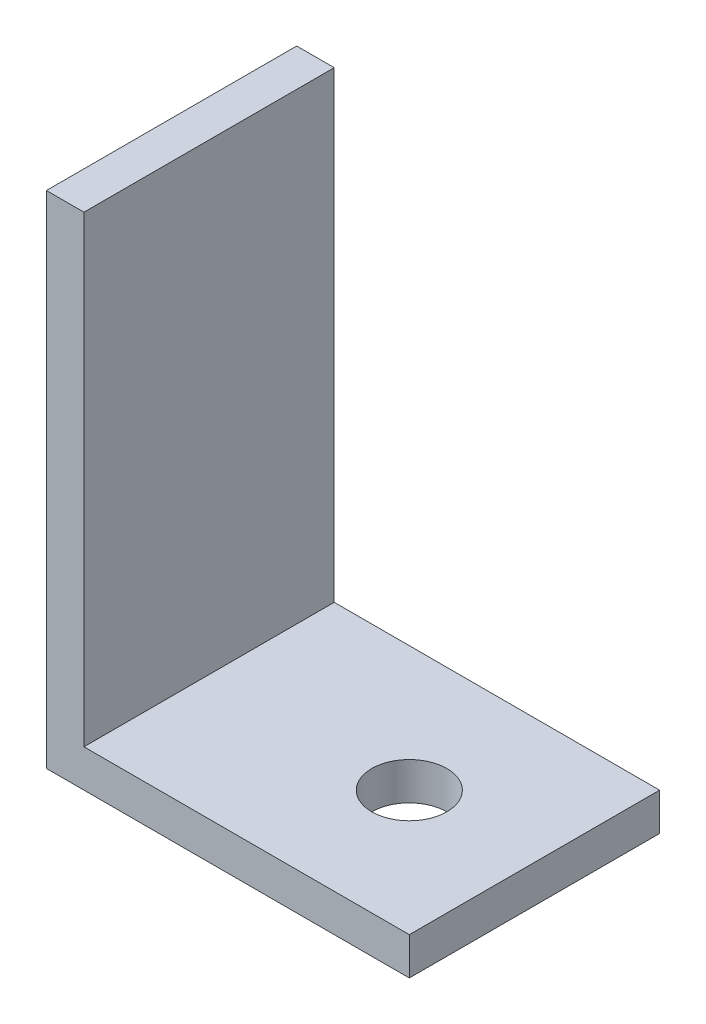
ISO-10303-21;
HEADER;
FILE_DESCRIPTION(('STEP AP214'),'2;1');
FILE_NAME('part.step','',(''),(''),'','','');
FILE_SCHEMA(('AUTOMOTIVE_DESIGN { 1 0 10303 214 1 1 1 1 }'));
ENDSEC;
DATA;
#1=APPLICATION_CONTEXT('core data for automotive mechanical design processes');
#2=APPLICATION_PROTOCOL_DEFINITION('international standard','automotive_design',2000,#1);
#3=PRODUCT_CONTEXT('',#1,'mechanical');
#4=PRODUCT('Part','Part','',(#3));
#5=PRODUCT_RELATED_PRODUCT_CATEGORY('part','',(#4));
#6=PRODUCT_DEFINITION_FORMATION('','',#4);
#7=PRODUCT_DEFINITION_CONTEXT('part definition',#1,'design');
#8=PRODUCT_DEFINITION('design','',#6,#7);
#9=PRODUCT_DEFINITION_SHAPE('','',#8);
#10=(LENGTH_UNIT() NAMED_UNIT(*) SI_UNIT(.MILLI.,.METRE.));
#11=(NAMED_UNIT(*) PLANE_ANGLE_UNIT() SI_UNIT($,.RADIAN.));
#12=(NAMED_UNIT(*) SI_UNIT($,.STERADIAN.) SOLID_ANGLE_UNIT());
#13=UNCERTAINTY_MEASURE_WITH_UNIT(LENGTH_MEASURE(1.E-05),#10,'distance_accuracy_value','');
#14=(GEOMETRIC_REPRESENTATION_CONTEXT(3) GLOBAL_UNCERTAINTY_ASSIGNED_CONTEXT((#13)) GLOBAL_UNIT_ASSIGNED_CONTEXT((#10,
#11,#12)) REPRESENTATION_CONTEXT('',''));
#15=CARTESIAN_POINT('',(0.,0.,0.));
#16=DIRECTION('',(0.,0.,1.));
#17=DIRECTION('',(1.,0.,0.));
#18=AXIS2_PLACEMENT_3D('',#15,#16,#17);
#19=CARTESIAN_POINT('',(29.,0.,20.));
#20=DIRECTION('',(0.,1.,0.));
#21=DIRECTION('',(-1.,0.,0.));
#22=AXIS2_PLACEMENT_3D('',#19,#20,#21);
#23=PLANE('',#22);
#24=CARTESIAN_POINT('',(19.,0.,10.));
#25=DIRECTION('',(0.,1.,0.));
#26=DIRECTION('',(-1.,0.,0.));
#27=AXIS2_PLACEMENT_3D('',#24,#25,#26);
#28=CIRCLE('',#27,3.);
#29=CARTESIAN_POINT('',(16.,0.,10.));
#30=VERTEX_POINT('',#29);
#31=EDGE_CURVE('E121',#30,#30,#28,.T.);
#32=ORIENTED_EDGE('',*,*,#31,.T.);
#33=EDGE_LOOP('',(#32));
#34=FACE_BOUND('',#33,.T.);
#35=DIRECTION('',(1.,0.,0.));
#36=VECTOR('',#35,1.);
#37=CARTESIAN_POINT('',(29.,0.,0.));
#38=LINE('',#37,#36);
#39=CARTESIAN_POINT('',(0.,0.,0.));
#40=VERTEX_POINT('',#39);
#41=CARTESIAN_POINT('',(29.,0.,0.));
#42=VERTEX_POINT('',#41);
#43=EDGE_CURVE('E117',#40,#42,#38,.T.);
#44=ORIENTED_EDGE('',*,*,#43,.T.);
#45=DIRECTION('',(0.,0.,-1.));
#46=VECTOR('',#45,1.);
#47=CARTESIAN_POINT('',(29.,0.,20.));
#48=LINE('',#47,#46);
#49=CARTESIAN_POINT('',(29.,0.,20.));
#50=VERTEX_POINT('',#49);
#51=EDGE_CURVE('E11',#50,#42,#48,.T.);
#52=ORIENTED_EDGE('',*,*,#51,.F.);
#53=DIRECTION('',(1.,0.,0.));
#54=VECTOR('',#53,1.);
#55=CARTESIAN_POINT('',(29.,0.,20.));
#56=LINE('',#55,#54);
#57=CARTESIAN_POINT('',(0.,0.,20.));
#58=VERTEX_POINT('',#57);
#59=EDGE_CURVE('E128',#58,#50,#56,.T.);
#60=ORIENTED_EDGE('',*,*,#59,.F.);
#61=DIRECTION('',(0.,0.,-1.));
#62=VECTOR('',#61,1.);
#63=CARTESIAN_POINT('',(0.,0.,20.));
#64=LINE('',#63,#62);
#65=EDGE_CURVE('E113',#58,#40,#64,.T.);
#66=ORIENTED_EDGE('',*,*,#65,.T.);
#67=EDGE_LOOP('',(#44,#52,#60,#66));
#68=FACE_BOUND('',#67,.T.);
#69=ADVANCED_FACE('F33',(#34,#68),#23,.F.);
#70=CARTESIAN_POINT('',(29.,3.,20.));
#71=DIRECTION('',(-1.,0.,0.));
#72=DIRECTION('',(0.,0.,1.));
#73=AXIS2_PLACEMENT_3D('',#70,#71,#72);
#74=PLANE('',#73);
#75=DIRECTION('',(0.,1.,0.));
#76=VECTOR('',#75,1.);
#77=CARTESIAN_POINT('',(29.,3.,0.));
#78=LINE('',#77,#76);
#79=CARTESIAN_POINT('',(29.,3.,0.));
#80=VERTEX_POINT('',#79);
#81=EDGE_CURVE('E120',#42,#80,#78,.T.);
#82=ORIENTED_EDGE('',*,*,#81,.T.);
#83=DIRECTION('',(0.,0.,-1.));
#84=VECTOR('',#83,1.);
#85=CARTESIAN_POINT('',(29.,3.,20.));
#86=LINE('',#85,#84);
#87=CARTESIAN_POINT('',(29.,3.,20.));
#88=VERTEX_POINT('',#87);
#89=EDGE_CURVE('E41',#88,#80,#86,.T.);
#90=ORIENTED_EDGE('',*,*,#89,.F.);
#91=DIRECTION('',(0.,1.,0.));
#92=VECTOR('',#91,1.);
#93=CARTESIAN_POINT('',(29.,3.,20.));
#94=LINE('',#93,#92);
#95=EDGE_CURVE('E86',#50,#88,#94,.T.);
#96=ORIENTED_EDGE('',*,*,#95,.F.);
#97=ORIENTED_EDGE('',*,*,#51,.T.);
#98=EDGE_LOOP('',(#82,#90,#96,#97));
#99=FACE_BOUND('',#98,.T.);
#100=ADVANCED_FACE('F152',(#99),#74,.F.);
#101=CARTESIAN_POINT('',(3.,3.,20.));
#102=DIRECTION('',(0.,-1.,0.));
#103=DIRECTION('',(1.,0.,0.));
#104=AXIS2_PLACEMENT_3D('',#101,#102,#103);
#105=PLANE('',#104);
#106=CARTESIAN_POINT('',(19.,3.,10.));
#107=DIRECTION('',(0.,1.,0.));
#108=DIRECTION('',(-1.,0.,0.));
#109=AXIS2_PLACEMENT_3D('',#106,#107,#108);
#110=CIRCLE('',#109,3.);
#111=CARTESIAN_POINT('',(16.,3.,10.));
#112=VERTEX_POINT('',#111);
#113=EDGE_CURVE('E160',#112,#112,#110,.T.);
#114=ORIENTED_EDGE('',*,*,#113,.F.);
#115=EDGE_LOOP('',(#114));
#116=FACE_BOUND('',#115,.T.);
#117=DIRECTION('',(-1.,0.,0.));
#118=VECTOR('',#117,1.);
#119=CARTESIAN_POINT('',(3.,3.,0.));
#120=LINE('',#119,#118);
#121=CARTESIAN_POINT('',(3.,3.,0.));
#122=VERTEX_POINT('',#121);
#123=EDGE_CURVE('E123',#80,#122,#120,.T.);
#124=ORIENTED_EDGE('',*,*,#123,.T.);
#125=DIRECTION('',(0.,0.,-1.));
#126=VECTOR('',#125,1.);
#127=CARTESIAN_POINT('',(3.,3.,20.));
#128=LINE('',#127,#126);
#129=CARTESIAN_POINT('',(3.,3.,20.));
#130=VERTEX_POINT('',#129);
#131=EDGE_CURVE('E108',#130,#122,#128,.T.);
#132=ORIENTED_EDGE('',*,*,#131,.F.);
#133=DIRECTION('',(-1.,0.,0.));
#134=VECTOR('',#133,1.);
#135=CARTESIAN_POINT('',(3.,3.,20.));
#136=LINE('',#135,#134);
#137=EDGE_CURVE('E99',#88,#130,#136,.T.);
#138=ORIENTED_EDGE('',*,*,#137,.F.);
#139=ORIENTED_EDGE('',*,*,#89,.T.);
#140=EDGE_LOOP('',(#124,#132,#138,#139));
#141=FACE_BOUND('',#140,.T.);
#142=ADVANCED_FACE('F134',(#116,#141),#105,.F.);
#143=CARTESIAN_POINT('',(3.,40.,20.));
#144=DIRECTION('',(-1.,0.,0.));
#145=DIRECTION('',(0.,-1.,0.));
#146=AXIS2_PLACEMENT_3D('',#143,#144,#145);
#147=PLANE('',#146);
#148=DIRECTION('',(0.,1.,0.));
#149=VECTOR('',#148,1.);
#150=CARTESIAN_POINT('',(3.,40.,0.));
#151=LINE('',#150,#149);
#152=CARTESIAN_POINT('',(3.,40.,0.));
#153=VERTEX_POINT('',#152);
#154=EDGE_CURVE('E107',#122,#153,#151,.T.);
#155=ORIENTED_EDGE('',*,*,#154,.T.);
#156=DIRECTION('',(0.,0.,-1.));
#157=VECTOR('',#156,1.);
#158=CARTESIAN_POINT('',(3.,40.,20.));
#159=LINE('',#158,#157);
#160=CARTESIAN_POINT('',(3.,40.,20.));
#161=VERTEX_POINT('',#160);
#162=EDGE_CURVE('E104',#161,#153,#159,.T.);
#163=ORIENTED_EDGE('',*,*,#162,.F.);
#164=DIRECTION('',(0.,1.,0.));
#165=VECTOR('',#164,1.);
#166=CARTESIAN_POINT('',(3.,40.,20.));
#167=LINE('',#166,#165);
#168=EDGE_CURVE('E93',#130,#161,#167,.T.);
#169=ORIENTED_EDGE('',*,*,#168,.F.);
#170=ORIENTED_EDGE('',*,*,#131,.T.);
#171=EDGE_LOOP('',(#155,#163,#169,#170));
#172=FACE_BOUND('',#171,.T.);
#173=ADVANCED_FACE('F105',(#172),#147,.F.);
#174=CARTESIAN_POINT('',(0.,40.,20.));
#175=DIRECTION('',(0.,-1.,0.));
#176=DIRECTION('',(0.,0.,-1.));
#177=AXIS2_PLACEMENT_3D('',#174,#175,#176);
#178=PLANE('',#177);
#179=DIRECTION('',(-1.,0.,0.));
#180=VECTOR('',#179,1.);
#181=CARTESIAN_POINT('',(0.,40.,0.));
#182=LINE('',#181,#180);
#183=CARTESIAN_POINT('',(0.,40.,0.));
#184=VERTEX_POINT('',#183);
#185=EDGE_CURVE('E72',#153,#184,#182,.T.);
#186=ORIENTED_EDGE('',*,*,#185,.T.);
#187=DIRECTION('',(0.,0.,-1.));
#188=VECTOR('',#187,1.);
#189=CARTESIAN_POINT('',(0.,40.,20.));
#190=LINE('',#189,#188);
#191=CARTESIAN_POINT('',(0.,40.,20.));
#192=VERTEX_POINT('',#191);
#193=EDGE_CURVE('E109',#192,#184,#190,.T.);
#194=ORIENTED_EDGE('',*,*,#193,.F.);
#195=DIRECTION('',(-1.,0.,0.));
#196=VECTOR('',#195,1.);
#197=CARTESIAN_POINT('',(0.,40.,20.));
#198=LINE('',#197,#196);
#199=EDGE_CURVE('E97',#161,#192,#198,.T.);
#200=ORIENTED_EDGE('',*,*,#199,.F.);
#201=ORIENTED_EDGE('',*,*,#162,.T.);
#202=EDGE_LOOP('',(#186,#194,#200,#201));
#203=FACE_BOUND('',#202,.T.);
#204=ADVANCED_FACE('F111',(#203),#178,.F.);
#205=CARTESIAN_POINT('',(0.,0.,20.));
#206=DIRECTION('',(1.,0.,0.));
#207=DIRECTION('',(0.,0.,-1.));
#208=AXIS2_PLACEMENT_3D('',#205,#206,#207);
#209=PLANE('',#208);
#210=DIRECTION('',(0.,-1.,0.));
#211=VECTOR('',#210,1.);
#212=CARTESIAN_POINT('',(0.,0.,0.));
#213=LINE('',#212,#211);
#214=EDGE_CURVE('E78',#184,#40,#213,.T.);
#215=ORIENTED_EDGE('',*,*,#214,.T.);
#216=ORIENTED_EDGE('',*,*,#65,.F.);
#217=DIRECTION('',(0.,-1.,0.));
#218=VECTOR('',#217,1.);
#219=CARTESIAN_POINT('',(0.,0.,20.));
#220=LINE('',#219,#218);
#221=EDGE_CURVE('E49',#192,#58,#220,.T.);
#222=ORIENTED_EDGE('',*,*,#221,.F.);
#223=ORIENTED_EDGE('',*,*,#193,.T.);
#224=EDGE_LOOP('',(#215,#216,#222,#223));
#225=FACE_BOUND('',#224,.T.);
#226=ADVANCED_FACE('F141',(#225),#209,.F.);
#227=CARTESIAN_POINT('',(0.,0.,20.));
#228=DIRECTION('',(0.,0.,-1.));
#229=DIRECTION('',(-1.,0.,0.));
#230=AXIS2_PLACEMENT_3D('',#227,#228,#229);
#231=PLANE('',#230);
#232=ORIENTED_EDGE('',*,*,#59,.T.);
#233=ORIENTED_EDGE('',*,*,#95,.T.);
#234=ORIENTED_EDGE('',*,*,#137,.T.);
#235=ORIENTED_EDGE('',*,*,#168,.T.);
#236=ORIENTED_EDGE('',*,*,#199,.T.);
#237=ORIENTED_EDGE('',*,*,#221,.T.);
#238=EDGE_LOOP('',(#232,#233,#234,#235,#236,#237));
#239=FACE_BOUND('',#238,.T.);
#240=ADVANCED_FACE('F95',(#239),#231,.F.);
#241=CARTESIAN_POINT('',(0.,0.,0.));
#242=DIRECTION('',(0.,0.,-1.));
#243=DIRECTION('',(-1.,0.,0.));
#244=AXIS2_PLACEMENT_3D('',#241,#242,#243);
#245=PLANE('',#244);
#246=ORIENTED_EDGE('',*,*,#43,.F.);
#247=ORIENTED_EDGE('',*,*,#214,.F.);
#248=ORIENTED_EDGE('',*,*,#185,.F.);
#249=ORIENTED_EDGE('',*,*,#154,.F.);
#250=ORIENTED_EDGE('',*,*,#123,.F.);
#251=ORIENTED_EDGE('',*,*,#81,.F.);
#252=EDGE_LOOP('',(#246,#247,#248,#249,#250,#251));
#253=FACE_BOUND('',#252,.T.);
#254=ADVANCED_FACE('F137',(#253),#245,.T.);
#255=CARTESIAN_POINT('',(19.,0.,10.));
#256=DIRECTION('',(0.,1.,0.));
#257=DIRECTION('',(-1.,0.,0.));
#258=AXIS2_PLACEMENT_3D('',#255,#256,#257);
#259=CYLINDRICAL_SURFACE('',#258,3.);
#260=ORIENTED_EDGE('',*,*,#31,.F.);
#261=EDGE_LOOP('',(#260));
#262=FACE_BOUND('',#261,.T.);
#263=ORIENTED_EDGE('',*,*,#113,.T.);
#264=EDGE_LOOP('',(#263));
#265=FACE_BOUND('',#264,.T.);
#266=ADVANCED_FACE('F168',(#262,#265),#259,.F.);
#267=CLOSED_SHELL('',(#69,#100,#142,#173,#204,#226,#240,#254,#266));
#268=MANIFOLD_SOLID_BREP('B2',#267);
#269=ADVANCED_BREP_SHAPE_REPRESENTATION('',(#18,#268),#14);
#270=SHAPE_DEFINITION_REPRESENTATION(#9,#269);
ENDSEC;
END-ISO-10303-21;
